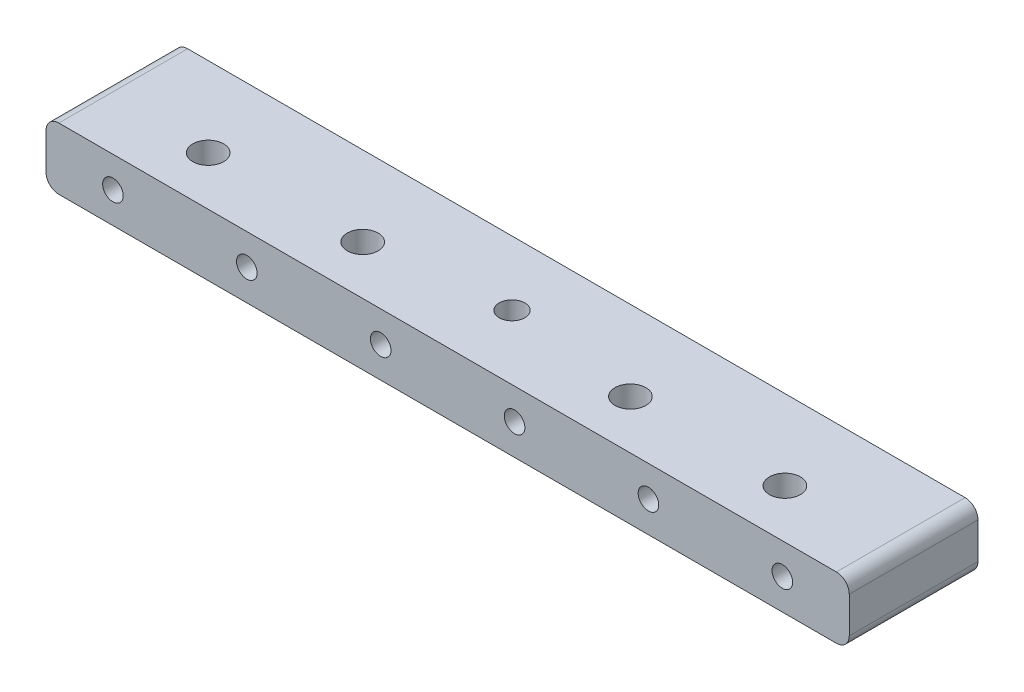
ISO-10303-21;
HEADER;
FILE_DESCRIPTION(('STEP AP214'),'2;1');
FILE_NAME('part.step','',(''),(''),'','','');
FILE_SCHEMA(('AUTOMOTIVE_DESIGN { 1 0 10303 214 1 1 1 1 }'));
ENDSEC;
DATA;
#1=APPLICATION_CONTEXT('core data for automotive mechanical design processes');
#2=APPLICATION_PROTOCOL_DEFINITION('international standard','automotive_design',2000,#1);
#3=PRODUCT_CONTEXT('',#1,'mechanical');
#4=PRODUCT('Part','Part','',(#3));
#5=PRODUCT_RELATED_PRODUCT_CATEGORY('part','',(#4));
#6=PRODUCT_DEFINITION_FORMATION('','',#4);
#7=PRODUCT_DEFINITION_CONTEXT('part definition',#1,'design');
#8=PRODUCT_DEFINITION('design','',#6,#7);
#9=PRODUCT_DEFINITION_SHAPE('','',#8);
#10=(LENGTH_UNIT() NAMED_UNIT(*) SI_UNIT(.MILLI.,.METRE.));
#11=(NAMED_UNIT(*) PLANE_ANGLE_UNIT() SI_UNIT($,.RADIAN.));
#12=(NAMED_UNIT(*) SI_UNIT($,.STERADIAN.) SOLID_ANGLE_UNIT());
#13=UNCERTAINTY_MEASURE_WITH_UNIT(LENGTH_MEASURE(1.E-05),#10,'distance_accuracy_value','');
#14=(GEOMETRIC_REPRESENTATION_CONTEXT(3) GLOBAL_UNCERTAINTY_ASSIGNED_CONTEXT((#13)) GLOBAL_UNIT_ASSIGNED_CONTEXT((#10,
#11,#12)) REPRESENTATION_CONTEXT('',''));
#15=CARTESIAN_POINT('',(0.,0.,0.));
#16=DIRECTION('',(0.,0.,1.));
#17=DIRECTION('',(1.,0.,0.));
#18=AXIS2_PLACEMENT_3D('',#15,#16,#17);
#19=CARTESIAN_POINT('',(65.,0.,2.5));
#20=DIRECTION('',(0.,0.,1.));
#21=DIRECTION('',(1.,0.,0.));
#22=AXIS2_PLACEMENT_3D('',#19,#20,#21);
#23=PLANE('',#22);
#24=CARTESIAN_POINT('',(65.,0.,2.5));
#25=DIRECTION('',(0.,0.,1.));
#26=DIRECTION('',(1.,0.,0.));
#27=AXIS2_PLACEMENT_3D('',#24,#25,#26);
#28=CIRCLE('',#27,2.);
#29=CARTESIAN_POINT('',(67.,0.,2.5));
#30=VERTEX_POINT('',#29);
#31=EDGE_CURVE('E11',#30,#30,#28,.T.);
#32=ORIENTED_EDGE('',*,*,#31,.T.);
#33=EDGE_LOOP('',(#32));
#34=FACE_BOUND('',#33,.T.);
#35=ADVANCED_FACE('F36',(#34),#23,.T.);
#36=CARTESIAN_POINT('',(65.,0.,2.5));
#37=DIRECTION('',(0.,0.,1.));
#38=DIRECTION('',(1.,0.,0.));
#39=AXIS2_PLACEMENT_3D('',#36,#37,#38);
#40=CYLINDRICAL_SURFACE('',#39,2.);
#41=ORIENTED_EDGE('',*,*,#31,.F.);
#42=EDGE_LOOP('',(#41));
#43=FACE_BOUND('',#42,.T.);
#44=CARTESIAN_POINT('',(65.,0.,12.5));
#45=DIRECTION('',(0.,0.,1.));
#46=DIRECTION('',(1.,0.,0.));
#47=AXIS2_PLACEMENT_3D('',#44,#45,#46);
#48=CIRCLE('',#47,2.);
#49=CARTESIAN_POINT('',(67.,0.,12.5));
#50=VERTEX_POINT('',#49);
#51=EDGE_CURVE('E43',#50,#50,#48,.T.);
#52=ORIENTED_EDGE('',*,*,#51,.T.);
#53=EDGE_LOOP('',(#52));
#54=FACE_BOUND('',#53,.T.);
#55=ADVANCED_FACE('F178',(#43,#54),#40,.F.);
#56=CARTESIAN_POINT('',(39.,0.,2.5));
#57=DIRECTION('',(0.,0.,1.));
#58=DIRECTION('',(1.,0.,0.));
#59=AXIS2_PLACEMENT_3D('',#56,#57,#58);
#60=PLANE('',#59);
#61=CARTESIAN_POINT('',(39.,0.,2.5));
#62=DIRECTION('',(0.,0.,1.));
#63=DIRECTION('',(1.,0.,0.));
#64=AXIS2_PLACEMENT_3D('',#61,#62,#63);
#65=CIRCLE('',#64,2.);
#66=CARTESIAN_POINT('',(41.,0.,2.5));
#67=VERTEX_POINT('',#66);
#68=EDGE_CURVE('E173',#67,#67,#65,.T.);
#69=ORIENTED_EDGE('',*,*,#68,.T.);
#70=EDGE_LOOP('',(#69));
#71=FACE_BOUND('',#70,.T.);
#72=ADVANCED_FACE('F201',(#71),#60,.T.);
#73=CARTESIAN_POINT('',(39.,0.,2.5));
#74=DIRECTION('',(0.,0.,1.));
#75=DIRECTION('',(1.,0.,0.));
#76=AXIS2_PLACEMENT_3D('',#73,#74,#75);
#77=CYLINDRICAL_SURFACE('',#76,2.);
#78=ORIENTED_EDGE('',*,*,#68,.F.);
#79=EDGE_LOOP('',(#78));
#80=FACE_BOUND('',#79,.T.);
#81=CARTESIAN_POINT('',(39.,0.,12.5));
#82=DIRECTION('',(0.,0.,1.));
#83=DIRECTION('',(1.,0.,0.));
#84=AXIS2_PLACEMENT_3D('',#81,#82,#83);
#85=CIRCLE('',#84,2.);
#86=CARTESIAN_POINT('',(41.,0.,12.5));
#87=VERTEX_POINT('',#86);
#88=EDGE_CURVE('E170',#87,#87,#85,.T.);
#89=ORIENTED_EDGE('',*,*,#88,.T.);
#90=EDGE_LOOP('',(#89));
#91=FACE_BOUND('',#90,.T.);
#92=ADVANCED_FACE('F207',(#80,#91),#77,.F.);
#93=CARTESIAN_POINT('',(13.,0.,2.5));
#94=DIRECTION('',(0.,0.,1.));
#95=DIRECTION('',(1.,0.,0.));
#96=AXIS2_PLACEMENT_3D('',#93,#94,#95);
#97=PLANE('',#96);
#98=CARTESIAN_POINT('',(13.,0.,2.5));
#99=DIRECTION('',(0.,0.,1.));
#100=DIRECTION('',(1.,0.,0.));
#101=AXIS2_PLACEMENT_3D('',#98,#99,#100);
#102=CIRCLE('',#101,2.);
#103=CARTESIAN_POINT('',(15.,0.,2.5));
#104=VERTEX_POINT('',#103);
#105=EDGE_CURVE('E167',#104,#104,#102,.T.);
#106=ORIENTED_EDGE('',*,*,#105,.T.);
#107=EDGE_LOOP('',(#106));
#108=FACE_BOUND('',#107,.T.);
#109=ADVANCED_FACE('F213',(#108),#97,.T.);
#110=CARTESIAN_POINT('',(13.,0.,2.5));
#111=DIRECTION('',(0.,0.,1.));
#112=DIRECTION('',(1.,0.,0.));
#113=AXIS2_PLACEMENT_3D('',#110,#111,#112);
#114=CYLINDRICAL_SURFACE('',#113,2.);
#115=ORIENTED_EDGE('',*,*,#105,.F.);
#116=EDGE_LOOP('',(#115));
#117=FACE_BOUND('',#116,.T.);
#118=CARTESIAN_POINT('',(13.,0.,12.5));
#119=DIRECTION('',(0.,0.,1.));
#120=DIRECTION('',(1.,0.,0.));
#121=AXIS2_PLACEMENT_3D('',#118,#119,#120);
#122=CIRCLE('',#121,2.);
#123=CARTESIAN_POINT('',(15.,0.,12.5));
#124=VERTEX_POINT('',#123);
#125=EDGE_CURVE('E164',#124,#124,#122,.T.);
#126=ORIENTED_EDGE('',*,*,#125,.T.);
#127=EDGE_LOOP('',(#126));
#128=FACE_BOUND('',#127,.T.);
#129=ADVANCED_FACE('F217',(#117,#128),#114,.F.);
#130=CARTESIAN_POINT('',(-13.,0.,2.5));
#131=DIRECTION('',(0.,0.,1.));
#132=DIRECTION('',(1.,0.,0.));
#133=AXIS2_PLACEMENT_3D('',#130,#131,#132);
#134=PLANE('',#133);
#135=CARTESIAN_POINT('',(-13.,0.,2.5));
#136=DIRECTION('',(0.,0.,1.));
#137=DIRECTION('',(1.,0.,0.));
#138=AXIS2_PLACEMENT_3D('',#135,#136,#137);
#139=CIRCLE('',#138,2.);
#140=CARTESIAN_POINT('',(-11.,0.,2.5));
#141=VERTEX_POINT('',#140);
#142=EDGE_CURVE('E161',#141,#141,#139,.T.);
#143=ORIENTED_EDGE('',*,*,#142,.T.);
#144=EDGE_LOOP('',(#143));
#145=FACE_BOUND('',#144,.T.);
#146=ADVANCED_FACE('F221',(#145),#134,.T.);
#147=CARTESIAN_POINT('',(-13.,0.,2.5));
#148=DIRECTION('',(0.,0.,1.));
#149=DIRECTION('',(1.,0.,0.));
#150=AXIS2_PLACEMENT_3D('',#147,#148,#149);
#151=CYLINDRICAL_SURFACE('',#150,2.);
#152=ORIENTED_EDGE('',*,*,#142,.F.);
#153=EDGE_LOOP('',(#152));
#154=FACE_BOUND('',#153,.T.);
#155=CARTESIAN_POINT('',(-13.,0.,12.5));
#156=DIRECTION('',(0.,0.,1.));
#157=DIRECTION('',(1.,0.,0.));
#158=AXIS2_PLACEMENT_3D('',#155,#156,#157);
#159=CIRCLE('',#158,2.);
#160=CARTESIAN_POINT('',(-11.,0.,12.5));
#161=VERTEX_POINT('',#160);
#162=EDGE_CURVE('E158',#161,#161,#159,.T.);
#163=ORIENTED_EDGE('',*,*,#162,.T.);
#164=EDGE_LOOP('',(#163));
#165=FACE_BOUND('',#164,.T.);
#166=ADVANCED_FACE('F225',(#154,#165),#151,.F.);
#167=CARTESIAN_POINT('',(0.,6.,0.));
#168=DIRECTION('',(0.,1.,0.));
#169=DIRECTION('',(0.,0.,1.));
#170=AXIS2_PLACEMENT_3D('',#167,#168,#169);
#171=PLANE('',#170);
#172=CARTESIAN_POINT('',(56.,6.,3.));
#173=DIRECTION('',(0.,1.,0.));
#174=DIRECTION('',(0.,0.,-1.));
#175=AXIS2_PLACEMENT_3D('',#172,#173,#174);
#176=CIRCLE('',#175,3.);
#177=CARTESIAN_POINT('',(56.,6.,0.));
#178=VERTEX_POINT('',#177);
#179=EDGE_CURVE('E320',#178,#178,#176,.T.);
#180=ORIENTED_EDGE('',*,*,#179,.F.);
#181=EDGE_LOOP('',(#180));
#182=FACE_BOUND('',#181,.T.);
#183=CARTESIAN_POINT('',(-56.,6.,3.));
#184=DIRECTION('',(0.,1.,0.));
#185=DIRECTION('',(0.,0.,1.));
#186=AXIS2_PLACEMENT_3D('',#183,#184,#185);
#187=CIRCLE('',#186,3.);
#188=CARTESIAN_POINT('',(-56.,6.,6.));
#189=VERTEX_POINT('',#188);
#190=EDGE_CURVE('E308',#189,#189,#187,.T.);
#191=ORIENTED_EDGE('',*,*,#190,.F.);
#192=EDGE_LOOP('',(#191));
#193=FACE_BOUND('',#192,.T.);
#194=DIRECTION('',(-1.,0.,0.));
#195=VECTOR('',#194,1.);
#196=CARTESIAN_POINT('',(-78.,6.,-12.5));
#197=LINE('',#196,#195);
#198=CARTESIAN_POINT('',(75.5,6.,-12.5));
#199=VERTEX_POINT('',#198);
#200=CARTESIAN_POINT('',(-75.5,6.,-12.5));
#201=VERTEX_POINT('',#200);
#202=EDGE_CURVE('E291',#199,#201,#197,.T.);
#203=ORIENTED_EDGE('',*,*,#202,.T.);
#204=DIRECTION('',(0.,0.,1.));
#205=VECTOR('',#204,1.);
#206=CARTESIAN_POINT('',(-75.5,6.,12.5));
#207=LINE('',#206,#205);
#208=CARTESIAN_POINT('',(-75.5,6.,12.5));
#209=VERTEX_POINT('',#208);
#210=EDGE_CURVE('E152',#201,#209,#207,.T.);
#211=ORIENTED_EDGE('',*,*,#210,.T.);
#212=DIRECTION('',(1.,0.,0.));
#213=VECTOR('',#212,1.);
#214=CARTESIAN_POINT('',(-78.,6.,12.5));
#215=LINE('',#214,#213);
#216=CARTESIAN_POINT('',(75.5,6.,12.5));
#217=VERTEX_POINT('',#216);
#218=EDGE_CURVE('E108',#209,#217,#215,.T.);
#219=ORIENTED_EDGE('',*,*,#218,.T.);
#220=DIRECTION('',(0.,0.,-1.));
#221=VECTOR('',#220,1.);
#222=CARTESIAN_POINT('',(75.5,6.,-12.5));
#223=LINE('',#222,#221);
#224=EDGE_CURVE('E149',#217,#199,#223,.T.);
#225=ORIENTED_EDGE('',*,*,#224,.T.);
#226=EDGE_LOOP('',(#203,#211,#219,#225));
#227=FACE_BOUND('',#226,.T.);
#228=CARTESIAN_POINT('',(0.,6.,0.));
#229=DIRECTION('',(0.,1.,0.));
#230=DIRECTION('',(0.,0.,1.));
#231=AXIS2_PLACEMENT_3D('',#228,#229,#230);
#232=CIRCLE('',#231,2.5);
#233=CARTESIAN_POINT('',(0.,6.,2.5));
#234=VERTEX_POINT('',#233);
#235=EDGE_CURVE('E284',#234,#234,#232,.T.);
#236=ORIENTED_EDGE('',*,*,#235,.F.);
#237=EDGE_LOOP('',(#236));
#238=FACE_BOUND('',#237,.T.);
#239=CARTESIAN_POINT('',(-26.,6.,3.));
#240=DIRECTION('',(0.,1.,0.));
#241=DIRECTION('',(0.,0.,1.));
#242=AXIS2_PLACEMENT_3D('',#239,#240,#241);
#243=CIRCLE('',#242,3.);
#244=CARTESIAN_POINT('',(-26.,6.,6.));
#245=VERTEX_POINT('',#244);
#246=EDGE_CURVE('E314',#245,#245,#243,.T.);
#247=ORIENTED_EDGE('',*,*,#246,.F.);
#248=EDGE_LOOP('',(#247));
#249=FACE_BOUND('',#248,.T.);
#250=CARTESIAN_POINT('',(26.,6.,3.));
#251=DIRECTION('',(0.,1.,0.));
#252=DIRECTION('',(0.,0.,-1.));
#253=AXIS2_PLACEMENT_3D('',#250,#251,#252);
#254=CIRCLE('',#253,3.);
#255=CARTESIAN_POINT('',(26.,6.,0.));
#256=VERTEX_POINT('',#255);
#257=EDGE_CURVE('E326',#256,#256,#254,.T.);
#258=ORIENTED_EDGE('',*,*,#257,.F.);
#259=EDGE_LOOP('',(#258));
#260=FACE_BOUND('',#259,.T.);
#261=ADVANCED_FACE('F229',(#182,#193,#227,#238,#249,#260),#171,.T.);
#262=CARTESIAN_POINT('',(0.,-6.,0.));
#263=DIRECTION('',(0.,1.,0.));
#264=DIRECTION('',(0.,0.,1.));
#265=AXIS2_PLACEMENT_3D('',#262,#263,#264);
#266=PLANE('',#265);
#267=DIRECTION('',(1.,0.,0.));
#268=VECTOR('',#267,1.);
#269=CARTESIAN_POINT('',(-78.,-6.,12.5));
#270=LINE('',#269,#268);
#271=CARTESIAN_POINT('',(-75.5,-6.,12.5));
#272=VERTEX_POINT('',#271);
#273=CARTESIAN_POINT('',(75.5,-6.,12.5));
#274=VERTEX_POINT('',#273);
#275=EDGE_CURVE('E283',#272,#274,#270,.T.);
#276=ORIENTED_EDGE('',*,*,#275,.F.);
#277=DIRECTION('',(0.,0.,1.));
#278=VECTOR('',#277,1.);
#279=CARTESIAN_POINT('',(-75.5,-6.,0.));
#280=LINE('',#279,#278);
#281=CARTESIAN_POINT('',(-75.5,-6.,-12.5));
#282=VERTEX_POINT('',#281);
#283=EDGE_CURVE('E142',#272,#282,#280,.F.);
#284=ORIENTED_EDGE('',*,*,#283,.T.);
#285=DIRECTION('',(-1.,0.,0.));
#286=VECTOR('',#285,1.);
#287=CARTESIAN_POINT('',(-78.,-6.,-12.5));
#288=LINE('',#287,#286);
#289=CARTESIAN_POINT('',(75.5,-6.,-12.5));
#290=VERTEX_POINT('',#289);
#291=EDGE_CURVE('E280',#290,#282,#288,.T.);
#292=ORIENTED_EDGE('',*,*,#291,.F.);
#293=DIRECTION('',(0.,0.,-1.));
#294=VECTOR('',#293,1.);
#295=CARTESIAN_POINT('',(75.5,-6.,0.));
#296=LINE('',#295,#294);
#297=EDGE_CURVE('E140',#290,#274,#296,.F.);
#298=ORIENTED_EDGE('',*,*,#297,.T.);
#299=EDGE_LOOP('',(#276,#284,#292,#298));
#300=FACE_BOUND('',#299,.T.);
#301=CARTESIAN_POINT('',(0.,-6.,0.));
#302=DIRECTION('',(0.,1.,0.));
#303=DIRECTION('',(0.,0.,1.));
#304=AXIS2_PLACEMENT_3D('',#301,#302,#303);
#305=CIRCLE('',#304,2.5);
#306=CARTESIAN_POINT('',(0.,-6.,2.5));
#307=VERTEX_POINT('',#306);
#308=EDGE_CURVE('E305',#307,#307,#305,.T.);
#309=ORIENTED_EDGE('',*,*,#308,.T.);
#310=EDGE_LOOP('',(#309));
#311=FACE_BOUND('',#310,.T.);
#312=CARTESIAN_POINT('',(-56.,-6.,3.));
#313=DIRECTION('',(0.,1.,0.));
#314=DIRECTION('',(0.,0.,1.));
#315=AXIS2_PLACEMENT_3D('',#312,#313,#314);
#316=CIRCLE('',#315,3.);
#317=CARTESIAN_POINT('',(-56.,-6.,6.));
#318=VERTEX_POINT('',#317);
#319=EDGE_CURVE('E311',#318,#318,#316,.T.);
#320=ORIENTED_EDGE('',*,*,#319,.T.);
#321=EDGE_LOOP('',(#320));
#322=FACE_BOUND('',#321,.T.);
#323=CARTESIAN_POINT('',(-26.,-6.,3.));
#324=DIRECTION('',(0.,1.,0.));
#325=DIRECTION('',(0.,0.,1.));
#326=AXIS2_PLACEMENT_3D('',#323,#324,#325);
#327=CIRCLE('',#326,3.);
#328=CARTESIAN_POINT('',(-26.,-6.,6.));
#329=VERTEX_POINT('',#328);
#330=EDGE_CURVE('E317',#329,#329,#327,.T.);
#331=ORIENTED_EDGE('',*,*,#330,.T.);
#332=EDGE_LOOP('',(#331));
#333=FACE_BOUND('',#332,.T.);
#334=CARTESIAN_POINT('',(56.,-6.,3.));
#335=DIRECTION('',(0.,1.,0.));
#336=DIRECTION('',(0.,0.,-1.));
#337=AXIS2_PLACEMENT_3D('',#334,#335,#336);
#338=CIRCLE('',#337,3.);
#339=CARTESIAN_POINT('',(56.,-6.,0.));
#340=VERTEX_POINT('',#339);
#341=EDGE_CURVE('E323',#340,#340,#338,.T.);
#342=ORIENTED_EDGE('',*,*,#341,.T.);
#343=EDGE_LOOP('',(#342));
#344=FACE_BOUND('',#343,.T.);
#345=CARTESIAN_POINT('',(26.,-6.,3.));
#346=DIRECTION('',(0.,1.,0.));
#347=DIRECTION('',(0.,0.,-1.));
#348=AXIS2_PLACEMENT_3D('',#345,#346,#347);
#349=CIRCLE('',#348,3.);
#350=CARTESIAN_POINT('',(26.,-6.,0.));
#351=VERTEX_POINT('',#350);
#352=EDGE_CURVE('E329',#351,#351,#349,.T.);
#353=ORIENTED_EDGE('',*,*,#352,.T.);
#354=EDGE_LOOP('',(#353));
#355=FACE_BOUND('',#354,.T.);
#356=ADVANCED_FACE('F249',(#300,#311,#322,#333,#344,#355),#266,.F.);
#357=CARTESIAN_POINT('',(78.,6.,-12.5));
#358=DIRECTION('',(-1.,0.,0.));
#359=DIRECTION('',(0.,0.,1.));
#360=AXIS2_PLACEMENT_3D('',#357,#358,#359);
#361=PLANE('',#360);
#362=DIRECTION('',(0.,-1.,0.));
#363=VECTOR('',#362,1.);
#364=CARTESIAN_POINT('',(78.,6.,12.5));
#365=LINE('',#364,#363);
#366=CARTESIAN_POINT('',(78.,3.5,12.5));
#367=VERTEX_POINT('',#366);
#368=CARTESIAN_POINT('',(78.,-3.5,12.5));
#369=VERTEX_POINT('',#368);
#370=EDGE_CURVE('E125',#367,#369,#365,.T.);
#371=ORIENTED_EDGE('',*,*,#370,.T.);
#372=DIRECTION('',(0.,0.,-1.));
#373=VECTOR('',#372,1.);
#374=CARTESIAN_POINT('',(78.,-3.5,-12.5));
#375=LINE('',#374,#373);
#376=CARTESIAN_POINT('',(78.,-3.5,-12.5));
#377=VERTEX_POINT('',#376);
#378=EDGE_CURVE('E156',#369,#377,#375,.T.);
#379=ORIENTED_EDGE('',*,*,#378,.T.);
#380=DIRECTION('',(0.,-1.,0.));
#381=VECTOR('',#380,1.);
#382=CARTESIAN_POINT('',(78.,6.,-12.5));
#383=LINE('',#382,#381);
#384=CARTESIAN_POINT('',(78.,3.5,-12.5));
#385=VERTEX_POINT('',#384);
#386=EDGE_CURVE('E130',#385,#377,#383,.T.);
#387=ORIENTED_EDGE('',*,*,#386,.F.);
#388=DIRECTION('',(0.,0.,-1.));
#389=VECTOR('',#388,1.);
#390=CARTESIAN_POINT('',(78.,3.5,12.5));
#391=LINE('',#390,#389);
#392=EDGE_CURVE('E154',#385,#367,#391,.F.);
#393=ORIENTED_EDGE('',*,*,#392,.T.);
#394=EDGE_LOOP('',(#371,#379,#387,#393));
#395=FACE_BOUND('',#394,.T.);
#396=ADVANCED_FACE('F246',(#395),#361,.F.);
#397=CARTESIAN_POINT('',(-78.,6.,-12.5));
#398=DIRECTION('',(0.,0.,1.));
#399=DIRECTION('',(1.,0.,0.));
#400=AXIS2_PLACEMENT_3D('',#397,#398,#399);
#401=PLANE('',#400);
#402=CARTESIAN_POINT('',(-65.,0.,-12.5));
#403=DIRECTION('',(0.,0.,1.));
#404=DIRECTION('',(1.,0.,0.));
#405=AXIS2_PLACEMENT_3D('',#402,#403,#404);
#406=CIRCLE('',#405,2.);
#407=CARTESIAN_POINT('',(-63.,0.,-12.5));
#408=VERTEX_POINT('',#407);
#409=EDGE_CURVE('E258',#408,#408,#406,.T.);
#410=ORIENTED_EDGE('',*,*,#409,.T.);
#411=EDGE_LOOP('',(#410));
#412=FACE_BOUND('',#411,.T.);
#413=CARTESIAN_POINT('',(-39.,0.,-12.5));
#414=DIRECTION('',(0.,0.,1.));
#415=DIRECTION('',(1.,0.,0.));
#416=AXIS2_PLACEMENT_3D('',#413,#414,#415);
#417=CIRCLE('',#416,2.);
#418=CARTESIAN_POINT('',(-37.,0.,-12.5));
#419=VERTEX_POINT('',#418);
#420=EDGE_CURVE('E262',#419,#419,#417,.T.);
#421=ORIENTED_EDGE('',*,*,#420,.T.);
#422=EDGE_LOOP('',(#421));
#423=FACE_BOUND('',#422,.T.);
#424=CARTESIAN_POINT('',(-13.,0.,-12.5));
#425=DIRECTION('',(0.,0.,1.));
#426=DIRECTION('',(1.,0.,0.));
#427=AXIS2_PLACEMENT_3D('',#424,#425,#426);
#428=CIRCLE('',#427,2.);
#429=CARTESIAN_POINT('',(-11.,0.,-12.5));
#430=VERTEX_POINT('',#429);
#431=EDGE_CURVE('E266',#430,#430,#428,.T.);
#432=ORIENTED_EDGE('',*,*,#431,.T.);
#433=EDGE_LOOP('',(#432));
#434=FACE_BOUND('',#433,.T.);
#435=CARTESIAN_POINT('',(13.,0.,-12.5));
#436=DIRECTION('',(0.,0.,1.));
#437=DIRECTION('',(1.,0.,0.));
#438=AXIS2_PLACEMENT_3D('',#435,#436,#437);
#439=CIRCLE('',#438,2.);
#440=CARTESIAN_POINT('',(15.,0.,-12.5));
#441=VERTEX_POINT('',#440);
#442=EDGE_CURVE('E270',#441,#441,#439,.T.);
#443=ORIENTED_EDGE('',*,*,#442,.T.);
#444=EDGE_LOOP('',(#443));
#445=FACE_BOUND('',#444,.T.);
#446=CARTESIAN_POINT('',(39.,0.,-12.5));
#447=DIRECTION('',(0.,0.,1.));
#448=DIRECTION('',(1.,0.,0.));
#449=AXIS2_PLACEMENT_3D('',#446,#447,#448);
#450=CIRCLE('',#449,2.);
#451=CARTESIAN_POINT('',(41.,0.,-12.5));
#452=VERTEX_POINT('',#451);
#453=EDGE_CURVE('E274',#452,#452,#450,.T.);
#454=ORIENTED_EDGE('',*,*,#453,.T.);
#455=EDGE_LOOP('',(#454));
#456=FACE_BOUND('',#455,.T.);
#457=CARTESIAN_POINT('',(65.,0.,-12.5));
#458=DIRECTION('',(0.,0.,1.));
#459=DIRECTION('',(1.,0.,0.));
#460=AXIS2_PLACEMENT_3D('',#457,#458,#459);
#461=CIRCLE('',#460,2.);
#462=CARTESIAN_POINT('',(67.,0.,-12.5));
#463=VERTEX_POINT('',#462);
#464=EDGE_CURVE('E277',#463,#463,#461,.T.);
#465=ORIENTED_EDGE('',*,*,#464,.T.);
#466=EDGE_LOOP('',(#465));
#467=FACE_BOUND('',#466,.T.);
#468=ORIENTED_EDGE('',*,*,#291,.T.);
#469=CARTESIAN_POINT('',(-75.5,-3.5,-12.5));
#470=DIRECTION('',(0.,0.,1.));
#471=DIRECTION('',(1.,0.,0.));
#472=AXIS2_PLACEMENT_3D('',#469,#470,#471);
#473=CIRCLE('',#472,2.5);
#474=CARTESIAN_POINT('',(-78.,-3.5,-12.5));
#475=VERTEX_POINT('',#474);
#476=EDGE_CURVE('E147',#282,#475,#473,.F.);
#477=ORIENTED_EDGE('',*,*,#476,.T.);
#478=DIRECTION('',(0.,-1.,0.));
#479=VECTOR('',#478,1.);
#480=CARTESIAN_POINT('',(-78.,6.,-12.5));
#481=LINE('',#480,#479);
#482=CARTESIAN_POINT('',(-78.,3.5,-12.5));
#483=VERTEX_POINT('',#482);
#484=EDGE_CURVE('E124',#483,#475,#481,.T.);
#485=ORIENTED_EDGE('',*,*,#484,.F.);
#486=CARTESIAN_POINT('',(-75.5,3.5,-12.5));
#487=DIRECTION('',(0.,0.,1.));
#488=DIRECTION('',(1.,0.,0.));
#489=AXIS2_PLACEMENT_3D('',#486,#487,#488);
#490=CIRCLE('',#489,2.5);
#491=EDGE_CURVE('E129',#483,#201,#490,.F.);
#492=ORIENTED_EDGE('',*,*,#491,.T.);
#493=ORIENTED_EDGE('',*,*,#202,.F.);
#494=CARTESIAN_POINT('',(75.5,3.5,-12.5));
#495=DIRECTION('',(0.,0.,1.));
#496=DIRECTION('',(1.,0.,0.));
#497=AXIS2_PLACEMENT_3D('',#494,#495,#496);
#498=CIRCLE('',#497,2.5);
#499=EDGE_CURVE('E58',#199,#385,#498,.F.);
#500=ORIENTED_EDGE('',*,*,#499,.T.);
#501=ORIENTED_EDGE('',*,*,#386,.T.);
#502=CARTESIAN_POINT('',(75.5,-3.5,-12.5));
#503=DIRECTION('',(0.,0.,1.));
#504=DIRECTION('',(1.,0.,0.));
#505=AXIS2_PLACEMENT_3D('',#502,#503,#504);
#506=CIRCLE('',#505,2.5);
#507=EDGE_CURVE('E50',#377,#290,#506,.F.);
#508=ORIENTED_EDGE('',*,*,#507,.T.);
#509=EDGE_LOOP('',(#468,#477,#485,#492,#493,#500,#501,#508));
#510=FACE_BOUND('',#509,.T.);
#511=ADVANCED_FACE('F191',(#412,#423,#434,#445,#456,#467,#510),#401,.F.);
#512=CARTESIAN_POINT('',(-78.,6.,-12.5));
#513=DIRECTION('',(1.,0.,0.));
#514=DIRECTION('',(0.,0.,-1.));
#515=AXIS2_PLACEMENT_3D('',#512,#513,#514);
#516=PLANE('',#515);
#517=ORIENTED_EDGE('',*,*,#484,.T.);
#518=DIRECTION('',(0.,0.,1.));
#519=VECTOR('',#518,1.);
#520=CARTESIAN_POINT('',(-78.,-3.5,-12.5));
#521=LINE('',#520,#519);
#522=CARTESIAN_POINT('',(-78.,-3.5,12.5));
#523=VERTEX_POINT('',#522);
#524=EDGE_CURVE('E123',#475,#523,#521,.T.);
#525=ORIENTED_EDGE('',*,*,#524,.T.);
#526=DIRECTION('',(0.,-1.,0.));
#527=VECTOR('',#526,1.);
#528=CARTESIAN_POINT('',(-78.,6.,12.5));
#529=LINE('',#528,#527);
#530=CARTESIAN_POINT('',(-78.,3.5,12.5));
#531=VERTEX_POINT('',#530);
#532=EDGE_CURVE('E106',#531,#523,#529,.T.);
#533=ORIENTED_EDGE('',*,*,#532,.F.);
#534=DIRECTION('',(0.,0.,1.));
#535=VECTOR('',#534,1.);
#536=CARTESIAN_POINT('',(-78.,3.5,-12.5));
#537=LINE('',#536,#535);
#538=EDGE_CURVE('E120',#531,#483,#537,.F.);
#539=ORIENTED_EDGE('',*,*,#538,.T.);
#540=EDGE_LOOP('',(#517,#525,#533,#539));
#541=FACE_BOUND('',#540,.T.);
#542=ADVANCED_FACE('F119',(#541),#516,.F.);
#543=CARTESIAN_POINT('',(-78.,6.,12.5));
#544=DIRECTION('',(0.,0.,-1.));
#545=DIRECTION('',(-1.,0.,0.));
#546=AXIS2_PLACEMENT_3D('',#543,#544,#545);
#547=PLANE('',#546);
#548=CARTESIAN_POINT('',(-39.,0.,12.5));
#549=DIRECTION('',(0.,0.,1.));
#550=DIRECTION('',(1.,0.,0.));
#551=AXIS2_PLACEMENT_3D('',#548,#549,#550);
#552=CIRCLE('',#551,2.);
#553=CARTESIAN_POINT('',(-37.,0.,12.5));
#554=VERTEX_POINT('',#553);
#555=EDGE_CURVE('E343',#554,#554,#552,.T.);
#556=ORIENTED_EDGE('',*,*,#555,.F.);
#557=EDGE_LOOP('',(#556));
#558=FACE_BOUND('',#557,.T.);
#559=CARTESIAN_POINT('',(-65.,0.,12.5));
#560=DIRECTION('',(0.,0.,1.));
#561=DIRECTION('',(1.,0.,0.));
#562=AXIS2_PLACEMENT_3D('',#559,#560,#561);
#563=CIRCLE('',#562,2.);
#564=CARTESIAN_POINT('',(-63.,0.,12.5));
#565=VERTEX_POINT('',#564);
#566=EDGE_CURVE('E335',#565,#565,#563,.T.);
#567=ORIENTED_EDGE('',*,*,#566,.F.);
#568=EDGE_LOOP('',(#567));
#569=FACE_BOUND('',#568,.T.);
#570=ORIENTED_EDGE('',*,*,#532,.T.);
#571=CARTESIAN_POINT('',(-75.5,-3.5,12.5));
#572=DIRECTION('',(0.,0.,-1.));
#573=DIRECTION('',(-1.,0.,0.));
#574=AXIS2_PLACEMENT_3D('',#571,#572,#573);
#575=CIRCLE('',#574,2.5);
#576=EDGE_CURVE('E113',#523,#272,#575,.F.);
#577=ORIENTED_EDGE('',*,*,#576,.T.);
#578=ORIENTED_EDGE('',*,*,#275,.T.);
#579=CARTESIAN_POINT('',(75.5,-3.5,12.5));
#580=DIRECTION('',(0.,0.,-1.));
#581=DIRECTION('',(-1.,0.,0.));
#582=AXIS2_PLACEMENT_3D('',#579,#580,#581);
#583=CIRCLE('',#582,2.5);
#584=EDGE_CURVE('E114',#274,#369,#583,.F.);
#585=ORIENTED_EDGE('',*,*,#584,.T.);
#586=ORIENTED_EDGE('',*,*,#370,.F.);
#587=CARTESIAN_POINT('',(75.5,3.5,12.5));
#588=DIRECTION('',(0.,0.,-1.));
#589=DIRECTION('',(-1.,0.,0.));
#590=AXIS2_PLACEMENT_3D('',#587,#588,#589);
#591=CIRCLE('',#590,2.5);
#592=EDGE_CURVE('E132',#367,#217,#591,.F.);
#593=ORIENTED_EDGE('',*,*,#592,.T.);
#594=ORIENTED_EDGE('',*,*,#218,.F.);
#595=CARTESIAN_POINT('',(-75.5,3.5,12.5));
#596=DIRECTION('',(0.,0.,-1.));
#597=DIRECTION('',(-1.,0.,0.));
#598=AXIS2_PLACEMENT_3D('',#595,#596,#597);
#599=CIRCLE('',#598,2.5);
#600=EDGE_CURVE('E102',#209,#531,#599,.F.);
#601=ORIENTED_EDGE('',*,*,#600,.T.);
#602=EDGE_LOOP('',(#570,#577,#578,#585,#586,#593,#594,#601));
#603=FACE_BOUND('',#602,.T.);
#604=ORIENTED_EDGE('',*,*,#162,.F.);
#605=EDGE_LOOP('',(#604));
#606=FACE_BOUND('',#605,.T.);
#607=ORIENTED_EDGE('',*,*,#125,.F.);
#608=EDGE_LOOP('',(#607));
#609=FACE_BOUND('',#608,.T.);
#610=ORIENTED_EDGE('',*,*,#88,.F.);
#611=EDGE_LOOP('',(#610));
#612=FACE_BOUND('',#611,.T.);
#613=ORIENTED_EDGE('',*,*,#51,.F.);
#614=EDGE_LOOP('',(#613));
#615=FACE_BOUND('',#614,.T.);
#616=ADVANCED_FACE('F104',(#558,#569,#603,#606,#609,#612,#615),#547,.F.);
#617=CARTESIAN_POINT('',(0.,6.,0.));
#618=DIRECTION('',(0.,-1.,0.));
#619=DIRECTION('',(0.,0.,-1.));
#620=AXIS2_PLACEMENT_3D('',#617,#618,#619);
#621=CYLINDRICAL_SURFACE('',#620,2.5);
#622=ORIENTED_EDGE('',*,*,#235,.T.);
#623=EDGE_LOOP('',(#622));
#624=FACE_BOUND('',#623,.T.);
#625=ORIENTED_EDGE('',*,*,#308,.F.);
#626=EDGE_LOOP('',(#625));
#627=FACE_BOUND('',#626,.T.);
#628=ADVANCED_FACE('F181',(#624,#627),#621,.F.);
#629=CARTESIAN_POINT('',(-56.,6.,3.));
#630=DIRECTION('',(0.,-1.,0.));
#631=DIRECTION('',(0.,0.,-1.));
#632=AXIS2_PLACEMENT_3D('',#629,#630,#631);
#633=CYLINDRICAL_SURFACE('',#632,3.);
#634=ORIENTED_EDGE('',*,*,#190,.T.);
#635=EDGE_LOOP('',(#634));
#636=FACE_BOUND('',#635,.T.);
#637=ORIENTED_EDGE('',*,*,#319,.F.);
#638=EDGE_LOOP('',(#637));
#639=FACE_BOUND('',#638,.T.);
#640=ADVANCED_FACE('F188',(#636,#639),#633,.F.);
#641=CARTESIAN_POINT('',(-26.,6.,3.));
#642=DIRECTION('',(0.,-1.,0.));
#643=DIRECTION('',(0.,0.,-1.));
#644=AXIS2_PLACEMENT_3D('',#641,#642,#643);
#645=CYLINDRICAL_SURFACE('',#644,3.);
#646=ORIENTED_EDGE('',*,*,#246,.T.);
#647=EDGE_LOOP('',(#646));
#648=FACE_BOUND('',#647,.T.);
#649=ORIENTED_EDGE('',*,*,#330,.F.);
#650=EDGE_LOOP('',(#649));
#651=FACE_BOUND('',#650,.T.);
#652=ADVANCED_FACE('F443',(#648,#651),#645,.F.);
#653=CARTESIAN_POINT('',(56.,6.,3.));
#654=DIRECTION('',(0.,-1.,0.));
#655=DIRECTION('',(0.,0.,-1.));
#656=AXIS2_PLACEMENT_3D('',#653,#654,#655);
#657=CYLINDRICAL_SURFACE('',#656,3.);
#658=ORIENTED_EDGE('',*,*,#179,.T.);
#659=EDGE_LOOP('',(#658));
#660=FACE_BOUND('',#659,.T.);
#661=ORIENTED_EDGE('',*,*,#341,.F.);
#662=EDGE_LOOP('',(#661));
#663=FACE_BOUND('',#662,.T.);
#664=ADVANCED_FACE('F439',(#660,#663),#657,.F.);
#665=CARTESIAN_POINT('',(26.,6.,3.));
#666=DIRECTION('',(0.,-1.,0.));
#667=DIRECTION('',(0.,0.,-1.));
#668=AXIS2_PLACEMENT_3D('',#665,#666,#667);
#669=CYLINDRICAL_SURFACE('',#668,3.);
#670=ORIENTED_EDGE('',*,*,#257,.T.);
#671=EDGE_LOOP('',(#670));
#672=FACE_BOUND('',#671,.T.);
#673=ORIENTED_EDGE('',*,*,#352,.F.);
#674=EDGE_LOOP('',(#673));
#675=FACE_BOUND('',#674,.T.);
#676=ADVANCED_FACE('F244',(#672,#675),#669,.F.);
#677=CARTESIAN_POINT('',(-75.5,-3.5,-12.5));
#678=DIRECTION('',(0.,0.,1.));
#679=DIRECTION('',(1.,0.,0.));
#680=AXIS2_PLACEMENT_3D('',#677,#678,#679);
#681=CYLINDRICAL_SURFACE('',#680,2.5);
#682=ORIENTED_EDGE('',*,*,#476,.F.);
#683=ORIENTED_EDGE('',*,*,#283,.F.);
#684=ORIENTED_EDGE('',*,*,#576,.F.);
#685=ORIENTED_EDGE('',*,*,#524,.F.);
#686=EDGE_LOOP('',(#682,#683,#684,#685));
#687=FACE_BOUND('',#686,.T.);
#688=ADVANCED_FACE('F241',(#687),#681,.T.);
#689=CARTESIAN_POINT('',(-75.5,3.5,0.));
#690=DIRECTION('',(0.,0.,-1.));
#691=DIRECTION('',(-1.,0.,0.));
#692=AXIS2_PLACEMENT_3D('',#689,#690,#691);
#693=CYLINDRICAL_SURFACE('',#692,2.5);
#694=ORIENTED_EDGE('',*,*,#491,.F.);
#695=ORIENTED_EDGE('',*,*,#538,.F.);
#696=ORIENTED_EDGE('',*,*,#600,.F.);
#697=ORIENTED_EDGE('',*,*,#210,.F.);
#698=EDGE_LOOP('',(#694,#695,#696,#697));
#699=FACE_BOUND('',#698,.T.);
#700=ADVANCED_FACE('F128',(#699),#693,.T.);
#701=CARTESIAN_POINT('',(75.5,-3.5,-12.5));
#702=DIRECTION('',(0.,0.,-1.));
#703=DIRECTION('',(-1.,0.,0.));
#704=AXIS2_PLACEMENT_3D('',#701,#702,#703);
#705=CYLINDRICAL_SURFACE('',#704,2.5);
#706=ORIENTED_EDGE('',*,*,#584,.F.);
#707=ORIENTED_EDGE('',*,*,#297,.F.);
#708=ORIENTED_EDGE('',*,*,#507,.F.);
#709=ORIENTED_EDGE('',*,*,#378,.F.);
#710=EDGE_LOOP('',(#706,#707,#708,#709));
#711=FACE_BOUND('',#710,.T.);
#712=ADVANCED_FACE('F235',(#711),#705,.T.);
#713=CARTESIAN_POINT('',(75.5,3.5,0.));
#714=DIRECTION('',(0.,0.,1.));
#715=DIRECTION('',(1.,0.,0.));
#716=AXIS2_PLACEMENT_3D('',#713,#714,#715);
#717=CYLINDRICAL_SURFACE('',#716,2.5);
#718=ORIENTED_EDGE('',*,*,#592,.F.);
#719=ORIENTED_EDGE('',*,*,#392,.F.);
#720=ORIENTED_EDGE('',*,*,#499,.F.);
#721=ORIENTED_EDGE('',*,*,#224,.F.);
#722=EDGE_LOOP('',(#718,#719,#720,#721));
#723=FACE_BOUND('',#722,.T.);
#724=ADVANCED_FACE('F231',(#723),#717,.T.);
#725=CARTESIAN_POINT('',(-65.,0.,2.5));
#726=DIRECTION('',(0.,0.,1.));
#727=DIRECTION('',(1.,0.,0.));
#728=AXIS2_PLACEMENT_3D('',#725,#726,#727);
#729=CYLINDRICAL_SURFACE('',#728,2.);
#730=CARTESIAN_POINT('',(-65.,0.,2.5));
#731=DIRECTION('',(0.,0.,1.));
#732=DIRECTION('',(1.,0.,0.));
#733=AXIS2_PLACEMENT_3D('',#730,#731,#732);
#734=CIRCLE('',#733,2.);
#735=CARTESIAN_POINT('',(-63.,0.,2.5));
#736=VERTEX_POINT('',#735);
#737=EDGE_CURVE('E332',#736,#736,#734,.T.);
#738=ORIENTED_EDGE('',*,*,#737,.F.);
#739=EDGE_LOOP('',(#738));
#740=FACE_BOUND('',#739,.T.);
#741=ORIENTED_EDGE('',*,*,#566,.T.);
#742=EDGE_LOOP('',(#741));
#743=FACE_BOUND('',#742,.T.);
#744=ADVANCED_FACE('F234',(#740,#743),#729,.F.);
#745=CARTESIAN_POINT('',(-65.,0.,2.5));
#746=DIRECTION('',(0.,0.,1.));
#747=DIRECTION('',(1.,0.,0.));
#748=AXIS2_PLACEMENT_3D('',#745,#746,#747);
#749=PLANE('',#748);
#750=ORIENTED_EDGE('',*,*,#737,.T.);
#751=EDGE_LOOP('',(#750));
#752=FACE_BOUND('',#751,.T.);
#753=ADVANCED_FACE('F429',(#752),#749,.T.);
#754=CARTESIAN_POINT('',(-39.,0.,2.5));
#755=DIRECTION('',(0.,0.,1.));
#756=DIRECTION('',(1.,0.,0.));
#757=AXIS2_PLACEMENT_3D('',#754,#755,#756);
#758=CYLINDRICAL_SURFACE('',#757,2.);
#759=CARTESIAN_POINT('',(-39.,0.,2.5));
#760=DIRECTION('',(0.,0.,1.));
#761=DIRECTION('',(1.,0.,0.));
#762=AXIS2_PLACEMENT_3D('',#759,#760,#761);
#763=CIRCLE('',#762,2.);
#764=CARTESIAN_POINT('',(-37.,0.,2.5));
#765=VERTEX_POINT('',#764);
#766=EDGE_CURVE('E338',#765,#765,#763,.T.);
#767=ORIENTED_EDGE('',*,*,#766,.F.);
#768=EDGE_LOOP('',(#767));
#769=FACE_BOUND('',#768,.T.);
#770=ORIENTED_EDGE('',*,*,#555,.T.);
#771=EDGE_LOOP('',(#770));
#772=FACE_BOUND('',#771,.T.);
#773=ADVANCED_FACE('F425',(#769,#772),#758,.F.);
#774=CARTESIAN_POINT('',(-39.,0.,2.5));
#775=DIRECTION('',(0.,0.,1.));
#776=DIRECTION('',(1.,0.,0.));
#777=AXIS2_PLACEMENT_3D('',#774,#775,#776);
#778=PLANE('',#777);
#779=ORIENTED_EDGE('',*,*,#766,.T.);
#780=EDGE_LOOP('',(#779));
#781=FACE_BOUND('',#780,.T.);
#782=ADVANCED_FACE('F421',(#781),#778,.T.);
#783=CARTESIAN_POINT('',(65.,0.,-2.5));
#784=DIRECTION('',(0.,0.,-1.));
#785=DIRECTION('',(-1.,0.,0.));
#786=AXIS2_PLACEMENT_3D('',#783,#784,#785);
#787=CYLINDRICAL_SURFACE('',#786,2.);
#788=CARTESIAN_POINT('',(65.,0.,-2.5));
#789=DIRECTION('',(0.,0.,1.));
#790=DIRECTION('',(1.,0.,0.));
#791=AXIS2_PLACEMENT_3D('',#788,#789,#790);
#792=CIRCLE('',#791,2.);
#793=CARTESIAN_POINT('',(67.,0.,-2.5));
#794=VERTEX_POINT('',#793);
#795=EDGE_CURVE('E348',#794,#794,#792,.T.);
#796=ORIENTED_EDGE('',*,*,#795,.T.);
#797=EDGE_LOOP('',(#796));
#798=FACE_BOUND('',#797,.T.);
#799=ORIENTED_EDGE('',*,*,#464,.F.);
#800=EDGE_LOOP('',(#799));
#801=FACE_BOUND('',#800,.T.);
#802=ADVANCED_FACE('F417',(#798,#801),#787,.F.);
#803=CARTESIAN_POINT('',(65.,0.,-2.5));
#804=DIRECTION('',(0.,0.,-1.));
#805=DIRECTION('',(1.,0.,0.));
#806=AXIS2_PLACEMENT_3D('',#803,#804,#805);
#807=PLANE('',#806);
#808=ORIENTED_EDGE('',*,*,#795,.F.);
#809=EDGE_LOOP('',(#808));
#810=FACE_BOUND('',#809,.T.);
#811=ADVANCED_FACE('F413',(#810),#807,.T.);
#812=CARTESIAN_POINT('',(39.,0.,-2.5));
#813=DIRECTION('',(0.,0.,-1.));
#814=DIRECTION('',(-1.,0.,0.));
#815=AXIS2_PLACEMENT_3D('',#812,#813,#814);
#816=CYLINDRICAL_SURFACE('',#815,2.);
#817=CARTESIAN_POINT('',(39.,0.,-2.5));
#818=DIRECTION('',(0.,0.,1.));
#819=DIRECTION('',(1.,0.,0.));
#820=AXIS2_PLACEMENT_3D('',#817,#818,#819);
#821=CIRCLE('',#820,2.);
#822=CARTESIAN_POINT('',(41.,0.,-2.5));
#823=VERTEX_POINT('',#822);
#824=EDGE_CURVE('E352',#823,#823,#821,.T.);
#825=ORIENTED_EDGE('',*,*,#824,.T.);
#826=EDGE_LOOP('',(#825));
#827=FACE_BOUND('',#826,.T.);
#828=ORIENTED_EDGE('',*,*,#453,.F.);
#829=EDGE_LOOP('',(#828));
#830=FACE_BOUND('',#829,.T.);
#831=ADVANCED_FACE('F409',(#827,#830),#816,.F.);
#832=CARTESIAN_POINT('',(39.,0.,-2.5));
#833=DIRECTION('',(0.,0.,-1.));
#834=DIRECTION('',(1.,0.,0.));
#835=AXIS2_PLACEMENT_3D('',#832,#833,#834);
#836=PLANE('',#835);
#837=ORIENTED_EDGE('',*,*,#824,.F.);
#838=EDGE_LOOP('',(#837));
#839=FACE_BOUND('',#838,.T.);
#840=ADVANCED_FACE('F405',(#839),#836,.T.);
#841=CARTESIAN_POINT('',(13.,0.,-2.5));
#842=DIRECTION('',(0.,0.,-1.));
#843=DIRECTION('',(-1.,0.,0.));
#844=AXIS2_PLACEMENT_3D('',#841,#842,#843);
#845=CYLINDRICAL_SURFACE('',#844,2.);
#846=CARTESIAN_POINT('',(13.,0.,-2.5));
#847=DIRECTION('',(0.,0.,1.));
#848=DIRECTION('',(1.,0.,0.));
#849=AXIS2_PLACEMENT_3D('',#846,#847,#848);
#850=CIRCLE('',#849,2.);
#851=CARTESIAN_POINT('',(15.,0.,-2.5));
#852=VERTEX_POINT('',#851);
#853=EDGE_CURVE('E356',#852,#852,#850,.T.);
#854=ORIENTED_EDGE('',*,*,#853,.T.);
#855=EDGE_LOOP('',(#854));
#856=FACE_BOUND('',#855,.T.);
#857=ORIENTED_EDGE('',*,*,#442,.F.);
#858=EDGE_LOOP('',(#857));
#859=FACE_BOUND('',#858,.T.);
#860=ADVANCED_FACE('F401',(#856,#859),#845,.F.);
#861=CARTESIAN_POINT('',(13.,0.,-2.5));
#862=DIRECTION('',(0.,0.,-1.));
#863=DIRECTION('',(1.,0.,0.));
#864=AXIS2_PLACEMENT_3D('',#861,#862,#863);
#865=PLANE('',#864);
#866=ORIENTED_EDGE('',*,*,#853,.F.);
#867=EDGE_LOOP('',(#866));
#868=FACE_BOUND('',#867,.T.);
#869=ADVANCED_FACE('F397',(#868),#865,.T.);
#870=CARTESIAN_POINT('',(-13.,0.,-2.5));
#871=DIRECTION('',(0.,0.,-1.));
#872=DIRECTION('',(-1.,0.,0.));
#873=AXIS2_PLACEMENT_3D('',#870,#871,#872);
#874=CYLINDRICAL_SURFACE('',#873,2.);
#875=CARTESIAN_POINT('',(-13.,0.,-2.5));
#876=DIRECTION('',(0.,0.,1.));
#877=DIRECTION('',(1.,0.,0.));
#878=AXIS2_PLACEMENT_3D('',#875,#876,#877);
#879=CIRCLE('',#878,2.);
#880=CARTESIAN_POINT('',(-11.,0.,-2.5));
#881=VERTEX_POINT('',#880);
#882=EDGE_CURVE('E360',#881,#881,#879,.T.);
#883=ORIENTED_EDGE('',*,*,#882,.T.);
#884=EDGE_LOOP('',(#883));
#885=FACE_BOUND('',#884,.T.);
#886=ORIENTED_EDGE('',*,*,#431,.F.);
#887=EDGE_LOOP('',(#886));
#888=FACE_BOUND('',#887,.T.);
#889=ADVANCED_FACE('F393',(#885,#888),#874,.F.);
#890=CARTESIAN_POINT('',(-13.,0.,-2.5));
#891=DIRECTION('',(0.,0.,-1.));
#892=DIRECTION('',(1.,0.,0.));
#893=AXIS2_PLACEMENT_3D('',#890,#891,#892);
#894=PLANE('',#893);
#895=ORIENTED_EDGE('',*,*,#882,.F.);
#896=EDGE_LOOP('',(#895));
#897=FACE_BOUND('',#896,.T.);
#898=ADVANCED_FACE('F389',(#897),#894,.T.);
#899=CARTESIAN_POINT('',(-39.,0.,-2.5));
#900=DIRECTION('',(0.,0.,-1.));
#901=DIRECTION('',(-1.,0.,0.));
#902=AXIS2_PLACEMENT_3D('',#899,#900,#901);
#903=CYLINDRICAL_SURFACE('',#902,2.);
#904=CARTESIAN_POINT('',(-39.,0.,-2.5));
#905=DIRECTION('',(0.,0.,1.));
#906=DIRECTION('',(1.,0.,0.));
#907=AXIS2_PLACEMENT_3D('',#904,#905,#906);
#908=CIRCLE('',#907,2.);
#909=CARTESIAN_POINT('',(-37.,0.,-2.5));
#910=VERTEX_POINT('',#909);
#911=EDGE_CURVE('E364',#910,#910,#908,.T.);
#912=ORIENTED_EDGE('',*,*,#911,.T.);
#913=EDGE_LOOP('',(#912));
#914=FACE_BOUND('',#913,.T.);
#915=ORIENTED_EDGE('',*,*,#420,.F.);
#916=EDGE_LOOP('',(#915));
#917=FACE_BOUND('',#916,.T.);
#918=ADVANCED_FACE('F385',(#914,#917),#903,.F.);
#919=CARTESIAN_POINT('',(-39.,0.,-2.5));
#920=DIRECTION('',(0.,0.,-1.));
#921=DIRECTION('',(1.,0.,0.));
#922=AXIS2_PLACEMENT_3D('',#919,#920,#921);
#923=PLANE('',#922);
#924=ORIENTED_EDGE('',*,*,#911,.F.);
#925=EDGE_LOOP('',(#924));
#926=FACE_BOUND('',#925,.T.);
#927=ADVANCED_FACE('F380',(#926),#923,.T.);
#928=CARTESIAN_POINT('',(-65.,0.,-2.5));
#929=DIRECTION('',(0.,0.,-1.));
#930=DIRECTION('',(-1.,0.,0.));
#931=AXIS2_PLACEMENT_3D('',#928,#929,#930);
#932=CYLINDRICAL_SURFACE('',#931,2.);
#933=CARTESIAN_POINT('',(-65.,0.,-2.5));
#934=DIRECTION('',(0.,0.,1.));
#935=DIRECTION('',(1.,0.,0.));
#936=AXIS2_PLACEMENT_3D('',#933,#934,#935);
#937=CIRCLE('',#936,2.);
#938=CARTESIAN_POINT('',(-63.,0.,-2.5));
#939=VERTEX_POINT('',#938);
#940=EDGE_CURVE('E346',#939,#939,#937,.T.);
#941=ORIENTED_EDGE('',*,*,#940,.T.);
#942=EDGE_LOOP('',(#941));
#943=FACE_BOUND('',#942,.T.);
#944=ORIENTED_EDGE('',*,*,#409,.F.);
#945=EDGE_LOOP('',(#944));
#946=FACE_BOUND('',#945,.T.);
#947=ADVANCED_FACE('F371',(#943,#946),#932,.F.);
#948=CARTESIAN_POINT('',(-65.,0.,-2.5));
#949=DIRECTION('',(0.,0.,-1.));
#950=DIRECTION('',(1.,0.,0.));
#951=AXIS2_PLACEMENT_3D('',#948,#949,#950);
#952=PLANE('',#951);
#953=ORIENTED_EDGE('',*,*,#940,.F.);
#954=EDGE_LOOP('',(#953));
#955=FACE_BOUND('',#954,.T.);
#956=ADVANCED_FACE('F374',(#955),#952,.T.);
#957=CLOSED_SHELL('',(#35,#55,#72,#92,#109,#129,#146,#166,#261,#356,#396,#511,#542,#616,#628,
#640,#652,#664,#676,#688,#700,#712,#724,#744,#753,#773,#782,#802,#811,#831,#840,#860,#869,#889,
#898,#918,#927,#947,#956));
#958=MANIFOLD_SOLID_BREP('B2',#957);
#959=ADVANCED_BREP_SHAPE_REPRESENTATION('',(#18,#958),#14);
#960=SHAPE_DEFINITION_REPRESENTATION(#9,#959);
ENDSEC;
END-ISO-10303-21;
